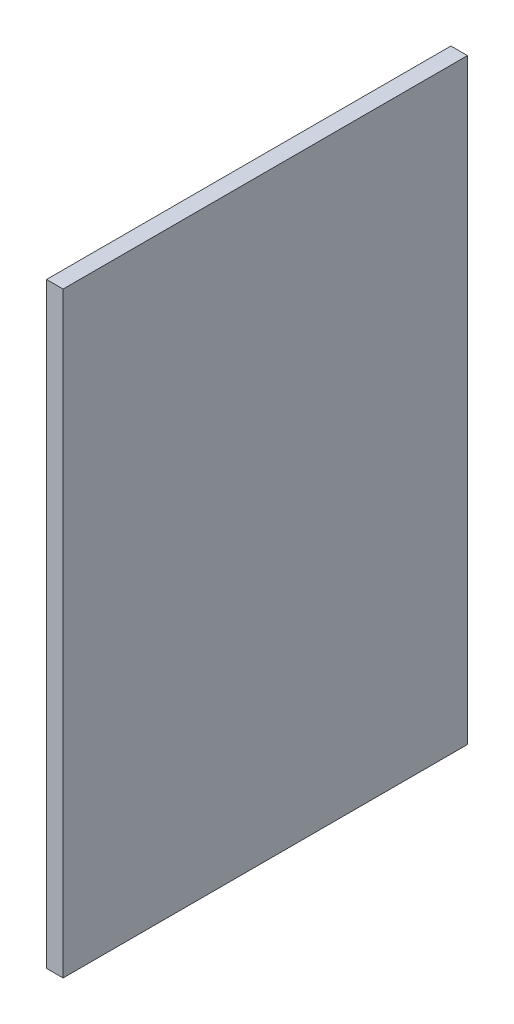
ISO-10303-21;
HEADER;
FILE_DESCRIPTION(('STEP AP214'),'2;1');
FILE_NAME('part.step','',(''),(''),'','','');
FILE_SCHEMA(('AUTOMOTIVE_DESIGN { 1 0 10303 214 1 1 1 1 }'));
ENDSEC;
DATA;
#1=APPLICATION_CONTEXT('core data for automotive mechanical design processes');
#2=APPLICATION_PROTOCOL_DEFINITION('international standard','automotive_design',2000,#1);
#3=PRODUCT_CONTEXT('',#1,'mechanical');
#4=PRODUCT('Part','Part','',(#3));
#5=PRODUCT_RELATED_PRODUCT_CATEGORY('part','',(#4));
#6=PRODUCT_DEFINITION_FORMATION('','',#4);
#7=PRODUCT_DEFINITION_CONTEXT('part definition',#1,'design');
#8=PRODUCT_DEFINITION('design','',#6,#7);
#9=PRODUCT_DEFINITION_SHAPE('','',#8);
#10=(LENGTH_UNIT() NAMED_UNIT(*) SI_UNIT(.MILLI.,.METRE.));
#11=(NAMED_UNIT(*) PLANE_ANGLE_UNIT() SI_UNIT($,.RADIAN.));
#12=(NAMED_UNIT(*) SI_UNIT($,.STERADIAN.) SOLID_ANGLE_UNIT());
#13=UNCERTAINTY_MEASURE_WITH_UNIT(LENGTH_MEASURE(1.E-05),#10,'distance_accuracy_value','');
#14=(GEOMETRIC_REPRESENTATION_CONTEXT(3) GLOBAL_UNCERTAINTY_ASSIGNED_CONTEXT((#13)) GLOBAL_UNIT_ASSIGNED_CONTEXT((#10,
#11,#12)) REPRESENTATION_CONTEXT('',''));
#15=CARTESIAN_POINT('',(0.,0.,0.));
#16=DIRECTION('',(0.,0.,1.));
#17=DIRECTION('',(1.,0.,0.));
#18=AXIS2_PLACEMENT_3D('',#15,#16,#17);
#19=CARTESIAN_POINT('',(3.175,0.,0.));
#20=DIRECTION('',(0.,0.,-1.));
#21=DIRECTION('',(-1.,0.,0.));
#22=AXIS2_PLACEMENT_3D('',#19,#20,#21);
#23=PLANE('',#22);
#24=DIRECTION('',(0.,-1.,0.));
#25=VECTOR('',#24,1.);
#26=CARTESIAN_POINT('',(0.,0.,0.));
#27=LINE('',#26,#25);
#28=CARTESIAN_POINT('',(0.,114.3,0.));
#29=VERTEX_POINT('',#28);
#30=CARTESIAN_POINT('',(0.,0.,0.));
#31=VERTEX_POINT('',#30);
#32=EDGE_CURVE('E96',#29,#31,#27,.T.);
#33=ORIENTED_EDGE('',*,*,#32,.T.);
#34=DIRECTION('',(-1.,0.,0.));
#35=VECTOR('',#34,1.);
#36=CARTESIAN_POINT('',(3.175,0.,0.));
#37=LINE('',#36,#35);
#38=CARTESIAN_POINT('',(3.175,0.,0.));
#39=VERTEX_POINT('',#38);
#40=EDGE_CURVE('E11',#39,#31,#37,.T.);
#41=ORIENTED_EDGE('',*,*,#40,.F.);
#42=DIRECTION('',(0.,-1.,0.));
#43=VECTOR('',#42,1.);
#44=CARTESIAN_POINT('',(3.175,0.,0.));
#45=LINE('',#44,#43);
#46=CARTESIAN_POINT('',(3.175,114.3,0.));
#47=VERTEX_POINT('',#46);
#48=EDGE_CURVE('E84',#47,#39,#45,.T.);
#49=ORIENTED_EDGE('',*,*,#48,.F.);
#50=DIRECTION('',(-1.,0.,0.));
#51=VECTOR('',#50,1.);
#52=CARTESIAN_POINT('',(3.175,114.3,0.));
#53=LINE('',#52,#51);
#54=EDGE_CURVE('E92',#47,#29,#53,.T.);
#55=ORIENTED_EDGE('',*,*,#54,.T.);
#56=EDGE_LOOP('',(#33,#41,#49,#55));
#57=FACE_BOUND('',#56,.T.);
#58=ADVANCED_FACE('F33',(#57),#23,.F.);
#59=CARTESIAN_POINT('',(3.175,0.,0.));
#60=DIRECTION('',(0.,1.,0.));
#61=DIRECTION('',(0.,0.,1.));
#62=AXIS2_PLACEMENT_3D('',#59,#60,#61);
#63=PLANE('',#62);
#64=DIRECTION('',(0.,0.,-1.));
#65=VECTOR('',#64,1.);
#66=CARTESIAN_POINT('',(0.,0.,0.));
#67=LINE('',#66,#65);
#68=CARTESIAN_POINT('',(0.,0.,-77.47));
#69=VERTEX_POINT('',#68);
#70=EDGE_CURVE('E88',#31,#69,#67,.T.);
#71=ORIENTED_EDGE('',*,*,#70,.T.);
#72=DIRECTION('',(-1.,0.,0.));
#73=VECTOR('',#72,1.);
#74=CARTESIAN_POINT('',(3.175,0.,-77.47));
#75=LINE('',#74,#73);
#76=CARTESIAN_POINT('',(3.175,0.,-77.47));
#77=VERTEX_POINT('',#76);
#78=EDGE_CURVE('E41',#77,#69,#75,.T.);
#79=ORIENTED_EDGE('',*,*,#78,.F.);
#80=DIRECTION('',(0.,0.,-1.));
#81=VECTOR('',#80,1.);
#82=CARTESIAN_POINT('',(3.175,0.,0.));
#83=LINE('',#82,#81);
#84=EDGE_CURVE('E79',#39,#77,#83,.T.);
#85=ORIENTED_EDGE('',*,*,#84,.F.);
#86=ORIENTED_EDGE('',*,*,#40,.T.);
#87=EDGE_LOOP('',(#71,#79,#85,#86));
#88=FACE_BOUND('',#87,.T.);
#89=ADVANCED_FACE('F87',(#88),#63,.F.);
#90=CARTESIAN_POINT('',(3.175,0.,-77.47));
#91=DIRECTION('',(0.,0.,1.));
#92=DIRECTION('',(1.,0.,0.));
#93=AXIS2_PLACEMENT_3D('',#90,#91,#92);
#94=PLANE('',#93);
#95=DIRECTION('',(0.,1.,0.));
#96=VECTOR('',#95,1.);
#97=CARTESIAN_POINT('',(0.,0.,-77.47));
#98=LINE('',#97,#96);
#99=CARTESIAN_POINT('',(0.,114.3,-77.47));
#100=VERTEX_POINT('',#99);
#101=EDGE_CURVE('E66',#69,#100,#98,.T.);
#102=ORIENTED_EDGE('',*,*,#101,.T.);
#103=DIRECTION('',(-1.,0.,0.));
#104=VECTOR('',#103,1.);
#105=CARTESIAN_POINT('',(3.175,114.3,-77.47));
#106=LINE('',#105,#104);
#107=CARTESIAN_POINT('',(3.175,114.3,-77.47));
#108=VERTEX_POINT('',#107);
#109=EDGE_CURVE('E89',#108,#100,#106,.T.);
#110=ORIENTED_EDGE('',*,*,#109,.F.);
#111=DIRECTION('',(0.,1.,0.));
#112=VECTOR('',#111,1.);
#113=CARTESIAN_POINT('',(3.175,0.,-77.47));
#114=LINE('',#113,#112);
#115=EDGE_CURVE('E82',#77,#108,#114,.T.);
#116=ORIENTED_EDGE('',*,*,#115,.F.);
#117=ORIENTED_EDGE('',*,*,#78,.T.);
#118=EDGE_LOOP('',(#102,#110,#116,#117));
#119=FACE_BOUND('',#118,.T.);
#120=ADVANCED_FACE('F90',(#119),#94,.F.);
#121=CARTESIAN_POINT('',(3.175,114.3,0.));
#122=DIRECTION('',(0.,-1.,0.));
#123=DIRECTION('',(0.,0.,-1.));
#124=AXIS2_PLACEMENT_3D('',#121,#122,#123);
#125=PLANE('',#124);
#126=DIRECTION('',(0.,0.,1.));
#127=VECTOR('',#126,1.);
#128=CARTESIAN_POINT('',(0.,114.3,0.));
#129=LINE('',#128,#127);
#130=EDGE_CURVE('E72',#100,#29,#129,.T.);
#131=ORIENTED_EDGE('',*,*,#130,.T.);
#132=ORIENTED_EDGE('',*,*,#54,.F.);
#133=DIRECTION('',(0.,0.,1.));
#134=VECTOR('',#133,1.);
#135=CARTESIAN_POINT('',(3.175,114.3,0.));
#136=LINE('',#135,#134);
#137=EDGE_CURVE('E49',#108,#47,#136,.T.);
#138=ORIENTED_EDGE('',*,*,#137,.F.);
#139=ORIENTED_EDGE('',*,*,#109,.T.);
#140=EDGE_LOOP('',(#131,#132,#138,#139));
#141=FACE_BOUND('',#140,.T.);
#142=ADVANCED_FACE('F103',(#141),#125,.F.);
#143=CARTESIAN_POINT('',(3.175,0.,0.));
#144=DIRECTION('',(-1.,0.,0.));
#145=DIRECTION('',(0.,0.,1.));
#146=AXIS2_PLACEMENT_3D('',#143,#144,#145);
#147=PLANE('',#146);
#148=ORIENTED_EDGE('',*,*,#48,.T.);
#149=ORIENTED_EDGE('',*,*,#84,.T.);
#150=ORIENTED_EDGE('',*,*,#115,.T.);
#151=ORIENTED_EDGE('',*,*,#137,.T.);
#152=EDGE_LOOP('',(#148,#149,#150,#151));
#153=FACE_BOUND('',#152,.T.);
#154=ADVANCED_FACE('F80',(#153),#147,.F.);
#155=CARTESIAN_POINT('',(0.,0.,0.));
#156=DIRECTION('',(-1.,0.,0.));
#157=DIRECTION('',(0.,0.,1.));
#158=AXIS2_PLACEMENT_3D('',#155,#156,#157);
#159=PLANE('',#158);
#160=ORIENTED_EDGE('',*,*,#32,.F.);
#161=ORIENTED_EDGE('',*,*,#130,.F.);
#162=ORIENTED_EDGE('',*,*,#101,.F.);
#163=ORIENTED_EDGE('',*,*,#70,.F.);
#164=EDGE_LOOP('',(#160,#161,#162,#163));
#165=FACE_BOUND('',#164,.T.);
#166=ADVANCED_FACE('F106',(#165),#159,.T.);
#167=CLOSED_SHELL('',(#58,#89,#120,#142,#154,#166));
#168=MANIFOLD_SOLID_BREP('B2',#167);
#169=ADVANCED_BREP_SHAPE_REPRESENTATION('',(#18,#168),#14);
#170=SHAPE_DEFINITION_REPRESENTATION(#9,#169);
ENDSEC;
END-ISO-10303-21;
